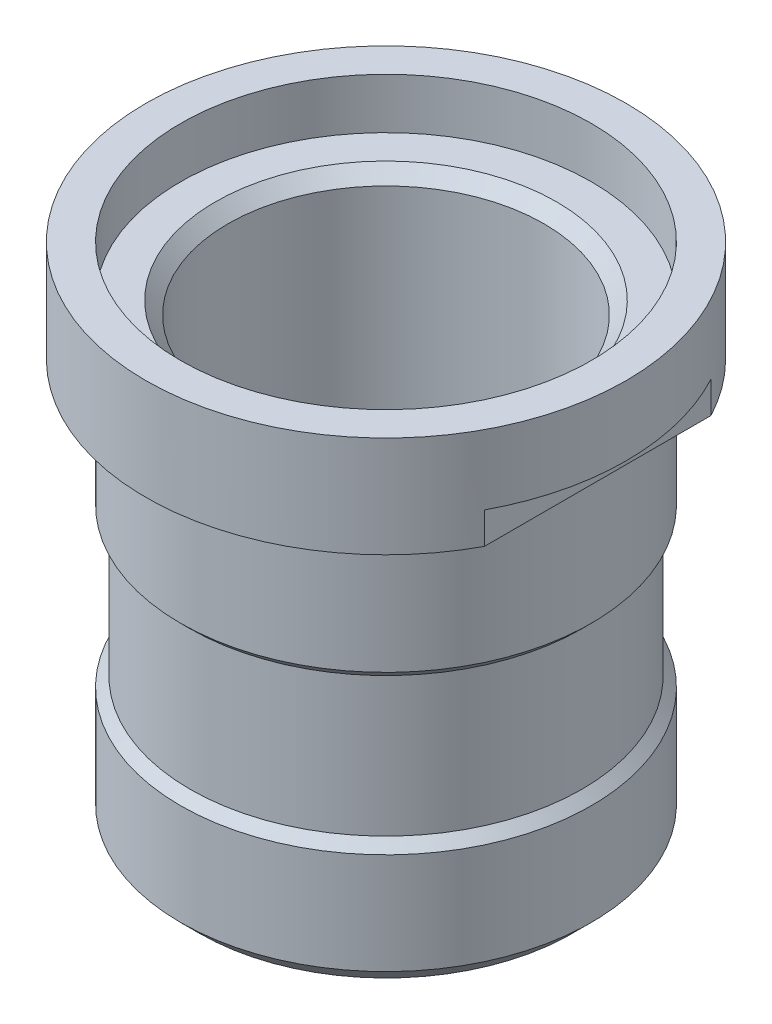
ISO-10303-21;
HEADER;
FILE_DESCRIPTION(('STEP AP214'),'2;1');
FILE_NAME('part.step','',(''),(''),'','','');
FILE_SCHEMA(('AUTOMOTIVE_DESIGN { 1 0 10303 214 1 1 1 1 }'));
ENDSEC;
DATA;
#1=APPLICATION_CONTEXT('core data for automotive mechanical design processes');
#2=APPLICATION_PROTOCOL_DEFINITION('international standard','automotive_design',2000,#1);
#3=PRODUCT_CONTEXT('',#1,'mechanical');
#4=PRODUCT('Part','Part','',(#3));
#5=PRODUCT_RELATED_PRODUCT_CATEGORY('part','',(#4));
#6=PRODUCT_DEFINITION_FORMATION('','',#4);
#7=PRODUCT_DEFINITION_CONTEXT('part definition',#1,'design');
#8=PRODUCT_DEFINITION('design','',#6,#7);
#9=PRODUCT_DEFINITION_SHAPE('','',#8);
#10=(LENGTH_UNIT() NAMED_UNIT(*) SI_UNIT(.MILLI.,.METRE.));
#11=(NAMED_UNIT(*) PLANE_ANGLE_UNIT() SI_UNIT($,.RADIAN.));
#12=(NAMED_UNIT(*) SI_UNIT($,.STERADIAN.) SOLID_ANGLE_UNIT());
#13=UNCERTAINTY_MEASURE_WITH_UNIT(LENGTH_MEASURE(1.E-05),#10,'distance_accuracy_value','');
#14=(GEOMETRIC_REPRESENTATION_CONTEXT(3) GLOBAL_UNCERTAINTY_ASSIGNED_CONTEXT((#13)) GLOBAL_UNIT_ASSIGNED_CONTEXT((#10,
#11,#12)) REPRESENTATION_CONTEXT('',''));
#15=CARTESIAN_POINT('',(0.,0.,0.));
#16=DIRECTION('',(0.,0.,1.));
#17=DIRECTION('',(1.,0.,0.));
#18=AXIS2_PLACEMENT_3D('',#15,#16,#17);
#19=CARTESIAN_POINT('',(-38.,80.,0.));
#20=DIRECTION('',(0.,-1.,0.));
#21=DIRECTION('',(0.,0.,-1.));
#22=AXIS2_PLACEMENT_3D('',#19,#20,#21);
#23=PLANE('',#22);
#24=CARTESIAN_POINT('',(0.,80.,0.));
#25=DIRECTION('',(0.,-1.,0.));
#26=DIRECTION('',(0.,0.,-1.));
#27=AXIS2_PLACEMENT_3D('',#24,#25,#26);
#28=CIRCLE('',#27,38.);
#29=CARTESIAN_POINT('',(0.,80.,-38.));
#30=VERTEX_POINT('',#29);
#31=EDGE_CURVE('E291',#30,#30,#28,.T.);
#32=ORIENTED_EDGE('',*,*,#31,.F.);
#33=EDGE_LOOP('',(#32));
#34=FACE_BOUND('',#33,.T.);
#35=CARTESIAN_POINT('',(0.,80.,0.));
#36=DIRECTION('',(0.,-1.,0.));
#37=DIRECTION('',(0.,0.,-1.));
#38=AXIS2_PLACEMENT_3D('',#35,#36,#37);
#39=CIRCLE('',#38,32.5);
#40=CARTESIAN_POINT('',(0.,80.,-32.5));
#41=VERTEX_POINT('',#40);
#42=EDGE_CURVE('E80',#41,#41,#39,.T.);
#43=ORIENTED_EDGE('',*,*,#42,.T.);
#44=EDGE_LOOP('',(#43));
#45=FACE_BOUND('',#44,.T.);
#46=ADVANCED_FACE('F45',(#34,#45),#23,.F.);
#47=CARTESIAN_POINT('',(0.,0.,0.));
#48=DIRECTION('',(0.,-1.,0.));
#49=DIRECTION('',(0.,0.,-1.));
#50=AXIS2_PLACEMENT_3D('',#47,#48,#49);
#51=CYLINDRICAL_SURFACE('',#50,32.5);
#52=ORIENTED_EDGE('',*,*,#42,.F.);
#53=EDGE_LOOP('',(#52));
#54=FACE_BOUND('',#53,.T.);
#55=CARTESIAN_POINT('',(0.,72.,0.));
#56=DIRECTION('',(0.,-1.,0.));
#57=DIRECTION('',(0.,0.,-1.));
#58=AXIS2_PLACEMENT_3D('',#55,#56,#57);
#59=CIRCLE('',#58,32.5);
#60=CARTESIAN_POINT('',(0.,72.,-32.5));
#61=VERTEX_POINT('',#60);
#62=EDGE_CURVE('E328',#61,#61,#59,.T.);
#63=ORIENTED_EDGE('',*,*,#62,.T.);
#64=EDGE_LOOP('',(#63));
#65=FACE_BOUND('',#64,.T.);
#66=ADVANCED_FACE('F111',(#54,#65),#51,.F.);
#67=CARTESIAN_POINT('',(-32.5,72.,0.));
#68=DIRECTION('',(0.,-1.,0.));
#69=DIRECTION('',(0.,0.,-1.));
#70=AXIS2_PLACEMENT_3D('',#67,#68,#69);
#71=PLANE('',#70);
#72=ORIENTED_EDGE('',*,*,#62,.F.);
#73=EDGE_LOOP('',(#72));
#74=FACE_BOUND('',#73,.T.);
#75=CARTESIAN_POINT('',(0.,72.,0.));
#76=DIRECTION('',(0.,-1.,0.));
#77=DIRECTION('',(0.,0.,-1.));
#78=AXIS2_PLACEMENT_3D('',#75,#76,#77);
#79=CIRCLE('',#78,27.);
#80=CARTESIAN_POINT('',(0.,72.,-27.));
#81=VERTEX_POINT('',#80);
#82=EDGE_CURVE('E324',#81,#81,#79,.T.);
#83=ORIENTED_EDGE('',*,*,#82,.T.);
#84=EDGE_LOOP('',(#83));
#85=FACE_BOUND('',#84,.T.);
#86=ADVANCED_FACE('F116',(#74,#85),#71,.F.);
#87=CARTESIAN_POINT('',(0.,70.,0.));
#88=DIRECTION('',(0.,1.,0.));
#89=DIRECTION('',(0.,0.,1.));
#90=AXIS2_PLACEMENT_3D('',#87,#88,#89);
#91=CONICAL_SURFACE('',#90,25.,0.785398163397452);
#92=ORIENTED_EDGE('',*,*,#82,.F.);
#93=EDGE_LOOP('',(#92));
#94=FACE_BOUND('',#93,.T.);
#95=CARTESIAN_POINT('',(0.,70.,0.));
#96=DIRECTION('',(0.,-1.,0.));
#97=DIRECTION('',(0.,0.,-1.));
#98=AXIS2_PLACEMENT_3D('',#95,#96,#97);
#99=CIRCLE('',#98,25.);
#100=CARTESIAN_POINT('',(0.,70.,-25.));
#101=VERTEX_POINT('',#100);
#102=EDGE_CURVE('E320',#101,#101,#99,.T.);
#103=ORIENTED_EDGE('',*,*,#102,.T.);
#104=EDGE_LOOP('',(#103));
#105=FACE_BOUND('',#104,.T.);
#106=ADVANCED_FACE('F124',(#94,#105),#91,.F.);
#107=CARTESIAN_POINT('',(0.,0.,0.));
#108=DIRECTION('',(0.,-1.,0.));
#109=DIRECTION('',(0.,0.,-1.));
#110=AXIS2_PLACEMENT_3D('',#107,#108,#109);
#111=CYLINDRICAL_SURFACE('',#110,25.);
#112=ORIENTED_EDGE('',*,*,#102,.F.);
#113=EDGE_LOOP('',(#112));
#114=FACE_BOUND('',#113,.T.);
#115=CARTESIAN_POINT('',(0.,0.,0.));
#116=DIRECTION('',(0.,-1.,0.));
#117=DIRECTION('',(0.,0.,-1.));
#118=AXIS2_PLACEMENT_3D('',#115,#116,#117);
#119=CIRCLE('',#118,25.);
#120=CARTESIAN_POINT('',(0.,0.,-25.));
#121=VERTEX_POINT('',#120);
#122=EDGE_CURVE('E316',#121,#121,#119,.T.);
#123=ORIENTED_EDGE('',*,*,#122,.T.);
#124=EDGE_LOOP('',(#123));
#125=FACE_BOUND('',#124,.T.);
#126=ADVANCED_FACE('F128',(#114,#125),#111,.F.);
#127=CARTESIAN_POINT('',(-32.5,0.,0.));
#128=DIRECTION('',(0.,1.,0.));
#129=DIRECTION('',(0.,0.,1.));
#130=AXIS2_PLACEMENT_3D('',#127,#128,#129);
#131=PLANE('',#130);
#132=CARTESIAN_POINT('',(0.,0.,0.));
#133=DIRECTION('',(0.,1.,0.));
#134=DIRECTION('',(0.,0.,1.));
#135=AXIS2_PLACEMENT_3D('',#132,#133,#134);
#136=CIRCLE('',#135,29.5);
#137=CARTESIAN_POINT('',(0.,0.,29.5));
#138=VERTEX_POINT('',#137);
#139=EDGE_CURVE('E55',#138,#138,#136,.F.);
#140=ORIENTED_EDGE('',*,*,#139,.T.);
#141=EDGE_LOOP('',(#140));
#142=FACE_BOUND('',#141,.T.);
#143=ORIENTED_EDGE('',*,*,#122,.F.);
#144=EDGE_LOOP('',(#143));
#145=FACE_BOUND('',#144,.T.);
#146=ADVANCED_FACE('F100',(#142,#145),#131,.F.);
#147=CARTESIAN_POINT('',(0.,0.,0.));
#148=DIRECTION('',(0.,-1.,0.));
#149=DIRECTION('',(0.,0.,-1.));
#150=AXIS2_PLACEMENT_3D('',#147,#148,#149);
#151=CYLINDRICAL_SURFACE('',#150,32.5);
#152=CARTESIAN_POINT('',(0.,3.,0.));
#153=DIRECTION('',(0.,1.,0.));
#154=DIRECTION('',(0.,0.,1.));
#155=AXIS2_PLACEMENT_3D('',#152,#153,#154);
#156=CIRCLE('',#155,32.5);
#157=CARTESIAN_POINT('',(0.,3.,32.5));
#158=VERTEX_POINT('',#157);
#159=EDGE_CURVE('E11',#158,#158,#156,.T.);
#160=ORIENTED_EDGE('',*,*,#159,.T.);
#161=EDGE_LOOP('',(#160));
#162=FACE_BOUND('',#161,.T.);
#163=CARTESIAN_POINT('',(0.,19.,0.));
#164=DIRECTION('',(0.,-1.,0.));
#165=DIRECTION('',(0.,0.,-1.));
#166=AXIS2_PLACEMENT_3D('',#163,#164,#165);
#167=CIRCLE('',#166,32.5);
#168=CARTESIAN_POINT('',(0.,19.,-32.5));
#169=VERTEX_POINT('',#168);
#170=EDGE_CURVE('E312',#169,#169,#167,.T.);
#171=ORIENTED_EDGE('',*,*,#170,.T.);
#172=EDGE_LOOP('',(#171));
#173=FACE_BOUND('',#172,.T.);
#174=ADVANCED_FACE('F135',(#162,#173),#151,.T.);
#175=CARTESIAN_POINT('',(0.,20.5,0.));
#176=DIRECTION('',(0.,-1.,0.));
#177=DIRECTION('',(0.,0.,-1.));
#178=AXIS2_PLACEMENT_3D('',#175,#176,#177);
#179=CONICAL_SURFACE('',#178,31.,0.78539816339745);
#180=ORIENTED_EDGE('',*,*,#170,.F.);
#181=EDGE_LOOP('',(#180));
#182=FACE_BOUND('',#181,.T.);
#183=CARTESIAN_POINT('',(0.,20.5,0.));
#184=DIRECTION('',(0.,-1.,0.));
#185=DIRECTION('',(0.,0.,-1.));
#186=AXIS2_PLACEMENT_3D('',#183,#184,#185);
#187=CIRCLE('',#186,31.);
#188=CARTESIAN_POINT('',(0.,20.5,-31.));
#189=VERTEX_POINT('',#188);
#190=EDGE_CURVE('E308',#189,#189,#187,.T.);
#191=ORIENTED_EDGE('',*,*,#190,.T.);
#192=EDGE_LOOP('',(#191));
#193=FACE_BOUND('',#192,.T.);
#194=ADVANCED_FACE('F138',(#182,#193),#179,.T.);
#195=CARTESIAN_POINT('',(0.,0.,0.));
#196=DIRECTION('',(0.,-1.,0.));
#197=DIRECTION('',(0.,0.,-1.));
#198=AXIS2_PLACEMENT_3D('',#195,#196,#197);
#199=CYLINDRICAL_SURFACE('',#198,31.);
#200=ORIENTED_EDGE('',*,*,#190,.F.);
#201=EDGE_LOOP('',(#200));
#202=FACE_BOUND('',#201,.T.);
#203=CARTESIAN_POINT('',(0.,42.5,0.));
#204=DIRECTION('',(0.,-1.,0.));
#205=DIRECTION('',(0.,0.,-1.));
#206=AXIS2_PLACEMENT_3D('',#203,#204,#205);
#207=CIRCLE('',#206,31.);
#208=CARTESIAN_POINT('',(0.,42.5,-31.));
#209=VERTEX_POINT('',#208);
#210=EDGE_CURVE('E304',#209,#209,#207,.T.);
#211=ORIENTED_EDGE('',*,*,#210,.T.);
#212=EDGE_LOOP('',(#211));
#213=FACE_BOUND('',#212,.T.);
#214=ADVANCED_FACE('F142',(#202,#213),#199,.T.);
#215=CARTESIAN_POINT('',(0.,44.,0.));
#216=DIRECTION('',(0.,1.,0.));
#217=DIRECTION('',(0.,0.,1.));
#218=AXIS2_PLACEMENT_3D('',#215,#216,#217);
#219=CONICAL_SURFACE('',#218,32.5,0.785398163397444);
#220=ORIENTED_EDGE('',*,*,#210,.F.);
#221=EDGE_LOOP('',(#220));
#222=FACE_BOUND('',#221,.T.);
#223=CARTESIAN_POINT('',(0.,44.,0.));
#224=DIRECTION('',(0.,-1.,0.));
#225=DIRECTION('',(0.,0.,-1.));
#226=AXIS2_PLACEMENT_3D('',#223,#224,#225);
#227=CIRCLE('',#226,32.5);
#228=CARTESIAN_POINT('',(0.,44.,-32.5));
#229=VERTEX_POINT('',#228);
#230=EDGE_CURVE('E295',#229,#229,#227,.T.);
#231=ORIENTED_EDGE('',*,*,#230,.T.);
#232=EDGE_LOOP('',(#231));
#233=FACE_BOUND('',#232,.T.);
#234=ADVANCED_FACE('F146',(#222,#233),#219,.T.);
#235=CARTESIAN_POINT('',(0.,0.,0.));
#236=DIRECTION('',(0.,-1.,0.));
#237=DIRECTION('',(0.,0.,-1.));
#238=AXIS2_PLACEMENT_3D('',#235,#236,#237);
#239=CYLINDRICAL_SURFACE('',#238,32.5);
#240=ORIENTED_EDGE('',*,*,#230,.F.);
#241=EDGE_LOOP('',(#240));
#242=FACE_BOUND('',#241,.T.);
#243=CARTESIAN_POINT('',(0.,64.,0.));
#244=DIRECTION('',(0.,-1.,0.));
#245=DIRECTION('',(0.,0.,-1.));
#246=AXIS2_PLACEMENT_3D('',#243,#244,#245);
#247=CIRCLE('',#246,32.5);
#248=CARTESIAN_POINT('',(0.,64.,-32.5));
#249=VERTEX_POINT('',#248);
#250=EDGE_CURVE('E289',#249,#249,#247,.T.);
#251=ORIENTED_EDGE('',*,*,#250,.T.);
#252=EDGE_LOOP('',(#251));
#253=FACE_BOUND('',#252,.T.);
#254=ADVANCED_FACE('F150',(#242,#253),#239,.T.);
#255=CARTESIAN_POINT('',(-38.,64.,0.));
#256=DIRECTION('',(0.,1.,0.));
#257=DIRECTION('',(0.,0.,1.));
#258=AXIS2_PLACEMENT_3D('',#255,#256,#257);
#259=PLANE('',#258);
#260=ORIENTED_EDGE('',*,*,#250,.F.);
#261=EDGE_LOOP('',(#260));
#262=FACE_BOUND('',#261,.T.);
#263=CARTESIAN_POINT('',(0.,64.,0.));
#264=DIRECTION('',(0.,-1.,0.));
#265=DIRECTION('',(0.,0.,-1.));
#266=AXIS2_PLACEMENT_3D('',#263,#264,#265);
#267=CIRCLE('',#266,38.);
#268=CARTESIAN_POINT('',(33.5,64.,17.9373911146521));
#269=VERTEX_POINT('',#268);
#270=CARTESIAN_POINT('',(33.5,64.,-17.9373911146521));
#271=VERTEX_POINT('',#270);
#272=EDGE_CURVE('E90',#269,#271,#267,.T.);
#273=ORIENTED_EDGE('',*,*,#272,.T.);
#274=DIRECTION('',(0.,0.,1.));
#275=VECTOR('',#274,1.);
#276=CARTESIAN_POINT('',(33.5,64.,0.));
#277=LINE('',#276,#275);
#278=EDGE_CURVE('E68',#271,#269,#277,.T.);
#279=ORIENTED_EDGE('',*,*,#278,.T.);
#280=EDGE_LOOP('',(#273,#279));
#281=FACE_BOUND('',#280,.T.);
#282=ADVANCED_FACE('F154',(#262,#281),#259,.F.);
#283=CARTESIAN_POINT('',(0.,0.,0.));
#284=DIRECTION('',(0.,-1.,0.));
#285=DIRECTION('',(0.,0.,-1.));
#286=AXIS2_PLACEMENT_3D('',#283,#284,#285);
#287=CYLINDRICAL_SURFACE('',#286,38.);
#288=CARTESIAN_POINT('',(0.,69.,0.));
#289=DIRECTION('',(0.,1.,0.));
#290=DIRECTION('',(0.,0.,1.));
#291=AXIS2_PLACEMENT_3D('',#288,#289,#290);
#292=CIRCLE('',#291,38.);
#293=CARTESIAN_POINT('',(33.5,69.,17.9373911146521));
#294=VERTEX_POINT('',#293);
#295=CARTESIAN_POINT('',(33.5,69.,-17.9373911146521));
#296=VERTEX_POINT('',#295);
#297=EDGE_CURVE('E74',#294,#296,#292,.T.);
#298=ORIENTED_EDGE('',*,*,#297,.T.);
#299=DIRECTION('',(0.,-1.,0.));
#300=VECTOR('',#299,1.);
#301=CARTESIAN_POINT('',(33.5,0.,-17.9373911146521));
#302=LINE('',#301,#300);
#303=EDGE_CURVE('E83',#296,#271,#302,.T.);
#304=ORIENTED_EDGE('',*,*,#303,.T.);
#305=ORIENTED_EDGE('',*,*,#272,.F.);
#306=DIRECTION('',(0.,-1.,0.));
#307=VECTOR('',#306,1.);
#308=CARTESIAN_POINT('',(33.5,0.,17.9373911146521));
#309=LINE('',#308,#307);
#310=EDGE_CURVE('E79',#269,#294,#309,.F.);
#311=ORIENTED_EDGE('',*,*,#310,.T.);
#312=EDGE_LOOP('',(#298,#304,#305,#311));
#313=FACE_BOUND('',#312,.T.);
#314=ORIENTED_EDGE('',*,*,#31,.T.);
#315=EDGE_LOOP('',(#314));
#316=FACE_BOUND('',#315,.T.);
#317=ADVANCED_FACE('F87',(#313,#316),#287,.T.);
#318=CARTESIAN_POINT('',(33.5,0.,-35.8097715088783));
#319=DIRECTION('',(-1.,0.,0.));
#320=DIRECTION('',(0.,0.,1.));
#321=AXIS2_PLACEMENT_3D('',#318,#319,#320);
#322=PLANE('',#321);
#323=DIRECTION('',(0.,0.,1.));
#324=VECTOR('',#323,1.);
#325=CARTESIAN_POINT('',(33.5,69.,-35.8097715088783));
#326=LINE('',#325,#324);
#327=EDGE_CURVE('E61',#296,#294,#326,.T.);
#328=ORIENTED_EDGE('',*,*,#327,.T.);
#329=ORIENTED_EDGE('',*,*,#310,.F.);
#330=ORIENTED_EDGE('',*,*,#278,.F.);
#331=ORIENTED_EDGE('',*,*,#303,.F.);
#332=EDGE_LOOP('',(#328,#329,#330,#331));
#333=FACE_BOUND('',#332,.T.);
#334=ADVANCED_FACE('F82',(#333),#322,.F.);
#335=CARTESIAN_POINT('',(0.,69.,0.));
#336=DIRECTION('',(0.,1.,0.));
#337=DIRECTION('',(0.,0.,1.));
#338=AXIS2_PLACEMENT_3D('',#335,#336,#337);
#339=PLANE('',#338);
#340=ORIENTED_EDGE('',*,*,#327,.F.);
#341=ORIENTED_EDGE('',*,*,#297,.F.);
#342=EDGE_LOOP('',(#340,#341));
#343=FACE_BOUND('',#342,.T.);
#344=ADVANCED_FACE('F75',(#343),#339,.F.);
#345=CARTESIAN_POINT('',(0.,0.,0.));
#346=DIRECTION('',(0.,1.,0.));
#347=DIRECTION('',(0.,0.,1.));
#348=AXIS2_PLACEMENT_3D('',#345,#346,#347);
#349=CONICAL_SURFACE('',#348,29.5,0.785398163397447);
#350=ORIENTED_EDGE('',*,*,#159,.F.);
#351=EDGE_LOOP('',(#350));
#352=FACE_BOUND('',#351,.T.);
#353=ORIENTED_EDGE('',*,*,#139,.F.);
#354=EDGE_LOOP('',(#353));
#355=FACE_BOUND('',#354,.T.);
#356=ADVANCED_FACE('F48',(#352,#355),#349,.T.);
#357=CLOSED_SHELL('',(#46,#66,#86,#106,#126,#146,#174,#194,#214,#234,#254,#282,#317,#334,#344,#356));
#358=MANIFOLD_SOLID_BREP('B2',#357);
#359=ADVANCED_BREP_SHAPE_REPRESENTATION('',(#18,#358),#14);
#360=SHAPE_DEFINITION_REPRESENTATION(#9,#359);
ENDSEC;
END-ISO-10303-21;
